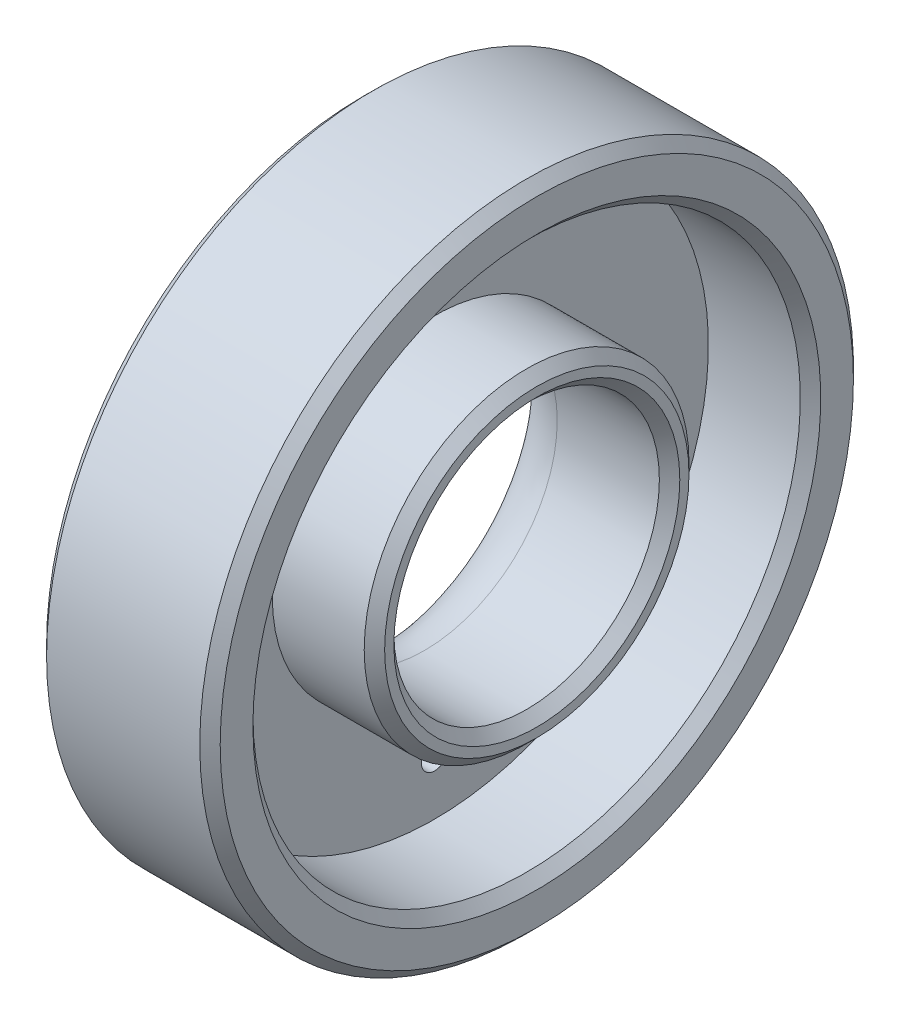
ISO-10303-21;
HEADER;
FILE_DESCRIPTION(('STEP AP214'),'2;1');
FILE_NAME('part.step','',(''),(''),'','','');
FILE_SCHEMA(('AUTOMOTIVE_DESIGN { 1 0 10303 214 1 1 1 1 }'));
ENDSEC;
DATA;
#1=APPLICATION_CONTEXT('core data for automotive mechanical design processes');
#2=APPLICATION_PROTOCOL_DEFINITION('international standard','automotive_design',2000,#1);
#3=PRODUCT_CONTEXT('',#1,'mechanical');
#4=PRODUCT('Part','Part','',(#3));
#5=PRODUCT_RELATED_PRODUCT_CATEGORY('part','',(#4));
#6=PRODUCT_DEFINITION_FORMATION('','',#4);
#7=PRODUCT_DEFINITION_CONTEXT('part definition',#1,'design');
#8=PRODUCT_DEFINITION('design','',#6,#7);
#9=PRODUCT_DEFINITION_SHAPE('','',#8);
#10=(LENGTH_UNIT() NAMED_UNIT(*) SI_UNIT(.MILLI.,.METRE.));
#11=(NAMED_UNIT(*) PLANE_ANGLE_UNIT() SI_UNIT($,.RADIAN.));
#12=(NAMED_UNIT(*) SI_UNIT($,.STERADIAN.) SOLID_ANGLE_UNIT());
#13=UNCERTAINTY_MEASURE_WITH_UNIT(LENGTH_MEASURE(1.E-05),#10,'distance_accuracy_value','');
#14=(GEOMETRIC_REPRESENTATION_CONTEXT(3) GLOBAL_UNCERTAINTY_ASSIGNED_CONTEXT((#13)) GLOBAL_UNIT_ASSIGNED_CONTEXT((#10,
#11,#12)) REPRESENTATION_CONTEXT('',''));
#15=CARTESIAN_POINT('',(0.,0.,0.));
#16=DIRECTION('',(0.,0.,1.));
#17=DIRECTION('',(1.,0.,0.));
#18=AXIS2_PLACEMENT_3D('',#15,#16,#17);
#19=CARTESIAN_POINT('',(0.,0.,0.));
#20=DIRECTION('',(-1.,0.,0.));
#21=DIRECTION('',(0.,0.,1.));
#22=AXIS2_PLACEMENT_3D('',#19,#20,#21);
#23=CYLINDRICAL_SURFACE('',#22,6.5);
#24=CARTESIAN_POINT('',(3.,0.,0.));
#25=DIRECTION('',(1.,0.,0.));
#26=DIRECTION('',(0.,0.,-1.));
#27=AXIS2_PLACEMENT_3D('',#24,#25,#26);
#28=CIRCLE('',#27,6.5);
#29=CARTESIAN_POINT('',(3.,0.,-6.5));
#30=VERTEX_POINT('',#29);
#31=EDGE_CURVE('E281',#30,#30,#28,.F.);
#32=ORIENTED_EDGE('',*,*,#31,.T.);
#33=EDGE_LOOP('',(#32));
#34=FACE_BOUND('',#33,.T.);
#35=CARTESIAN_POINT('',(7.99999999999999,0.,0.));
#36=DIRECTION('',(-1.,0.,0.));
#37=DIRECTION('',(0.,0.,1.));
#38=AXIS2_PLACEMENT_3D('',#35,#36,#37);
#39=CIRCLE('',#38,6.5);
#40=CARTESIAN_POINT('',(7.99999999999999,0.,6.5));
#41=VERTEX_POINT('',#40);
#42=EDGE_CURVE('E292',#41,#41,#39,.F.);
#43=ORIENTED_EDGE('',*,*,#42,.T.);
#44=EDGE_LOOP('',(#43));
#45=FACE_BOUND('',#44,.T.);
#46=ADVANCED_FACE('F75',(#34,#45),#23,.F.);
#47=CARTESIAN_POINT('',(0.,6.5,0.));
#48=DIRECTION('',(1.,0.,0.));
#49=DIRECTION('',(0.,0.,-1.));
#50=AXIS2_PLACEMENT_3D('',#47,#48,#49);
#51=PLANE('',#50);
#52=CARTESIAN_POINT('',(0.,0.,0.));
#53=DIRECTION('',(1.,0.,0.));
#54=DIRECTION('',(0.,0.,-1.));
#55=AXIS2_PLACEMENT_3D('',#52,#53,#54);
#56=CIRCLE('',#55,9.5);
#57=CARTESIAN_POINT('',(0.,0.,-9.5));
#58=VERTEX_POINT('',#57);
#59=EDGE_CURVE('E276',#58,#58,#56,.T.);
#60=ORIENTED_EDGE('',*,*,#59,.T.);
#61=EDGE_LOOP('',(#60));
#62=FACE_BOUND('',#61,.T.);
#63=CARTESIAN_POINT('',(0.,0.,0.));
#64=DIRECTION('',(-1.,0.,0.));
#65=DIRECTION('',(0.,0.,1.));
#66=AXIS2_PLACEMENT_3D('',#63,#64,#65);
#67=CIRCLE('',#66,10.);
#68=CARTESIAN_POINT('',(0.,0.,10.));
#69=VERTEX_POINT('',#68);
#70=EDGE_CURVE('E313',#69,#69,#67,.T.);
#71=ORIENTED_EDGE('',*,*,#70,.T.);
#72=EDGE_LOOP('',(#71));
#73=FACE_BOUND('',#72,.T.);
#74=ADVANCED_FACE('F210',(#62,#73),#51,.F.);
#75=CARTESIAN_POINT('',(0.,0.,0.));
#76=DIRECTION('',(-1.,0.,0.));
#77=DIRECTION('',(0.,0.,1.));
#78=AXIS2_PLACEMENT_3D('',#75,#76,#77);
#79=CYLINDRICAL_SURFACE('',#78,10.);
#80=CARTESIAN_POINT('',(1.,0.,0.));
#81=DIRECTION('',(1.,0.,0.));
#82=DIRECTION('',(0.,0.,-1.));
#83=AXIS2_PLACEMENT_3D('',#80,#81,#82);
#84=CIRCLE('',#83,10.);
#85=CARTESIAN_POINT('',(1.,9.99209730621221,-0.397481349482957));
#86=VERTEX_POINT('',#85);
#87=CARTESIAN_POINT('',(1.,-9.99209730621221,-0.397481349482957));
#88=VERTEX_POINT('',#87);
#89=EDGE_CURVE('E153',#86,#88,#84,.F.);
#90=ORIENTED_EDGE('',*,*,#89,.T.);
#91=CARTESIAN_POINT('',(1.01393889529611,-9.98748188079927,-0.500205638419064));
#92=CARTESIAN_POINT('',(1.26094614747874,-9.99108621051692,-0.428238881184554));
#93=CARTESIAN_POINT('',(1.2,-10.2392324063586,-0.458468346399119));
#94=CARTESIAN_POINT('',(1.00817827590106,-9.98845514776005,-0.480813657424555));
#95=CARTESIAN_POINT('',(1.24870135081678,-9.99092071823455,-0.428843020885227));
#96=CARTESIAN_POINT('',(1.2,-10.2308180850022,-0.450004270139507));
#97=CARTESIAN_POINT('',(1.00440826228374,-9.98938886193933,-0.461000762126404));
#98=CARTESIAN_POINT('',(1.23601976669922,-9.99102155969928,-0.425092530599041));
#99=CARTESIAN_POINT('',(1.2,-10.221857461722,-0.440540086592212));
#100=CARTESIAN_POINT('',(1.00016073447136,-9.99113208872384,-0.421486225170913));
#101=CARTESIAN_POINT('',(1.2127257776754,-9.99155617849597,-0.410882669632497));
#102=CARTESIAN_POINT('',(1.2,-10.2034733128877,-0.419704021681287));
#103=CARTESIAN_POINT('',(0.999607778645205,-9.99194400828471,-0.401792950222414));
#104=CARTESIAN_POINT('',(1.20199792857445,-9.99196522734535,-0.400926532510514));
#105=CARTESIAN_POINT('',(1.2,-10.1940656565981,-0.408382311025113));
#106=CARTESIAN_POINT('',(1.00122405165231,-9.99381676453322,-0.352835254848048));
#107=CARTESIAN_POINT('',(1.17918693129635,-9.99314951491188,-0.370720475428877));
#108=CARTESIAN_POINT('',(1.2,-10.1702810217527,-0.377417565216592));
#109=CARTESIAN_POINT('',(1.0048688408346,-9.99480312830396,-0.323636063819297));
#110=CARTESIAN_POINT('',(1.16822285164702,-9.99401151227683,-0.347790638035332));
#111=CARTESIAN_POINT('',(1.2,-10.1557395399794,-0.35642308983236));
#112=CARTESIAN_POINT('',(1.01542664626643,-9.9965209519464,-0.265398662147539));
#113=CARTESIAN_POINT('',(1.15261505228388,-9.99569114644533,-0.296115628221055));
#114=CARTESIAN_POINT('',(1.2,-10.1273304668872,-0.308759296438496));
#115=CARTESIAN_POINT('',(1.02239260456418,-9.99724793658135,-0.236371060231465));
#116=CARTESIAN_POINT('',(1.14763042473238,-9.99651923169225,-0.267345311364912));
#117=CARTESIAN_POINT('',(1.2,-10.1134779568295,-0.282002045668205));
#118=CARTESIAN_POINT('',(1.03477354028323,-9.99824974942065,-0.188086474825283));
#119=CARTESIAN_POINT('',(1.14301890866692,-9.99771820017016,-0.21637728575027));
#120=CARTESIAN_POINT('',(1.2,-10.0926462229877,-0.232559581718549));
#121=CARTESIAN_POINT('',(1.03994264235187,-9.99859462867629,-0.168763539561516));
#122=CARTESIAN_POINT('',(1.14210246227651,-9.99815109229987,-0.195299872111924));
#123=CARTESIAN_POINT('',(1.2,-10.0849066880229,-0.211440473911361));
#124=CARTESIAN_POINT('',(1.04976808189039,-9.9991741931411,-0.129970706323712));
#125=CARTESIAN_POINT('',(1.14142820767431,-9.99889078843015,-0.152026726884016));
#126=CARTESIAN_POINT('',(1.2,-10.0713027250444,-0.166693068270419));
#127=CARTESIAN_POINT('',(1.05442416997895,-9.99940882493719,-0.110500741748128));
#128=CARTESIAN_POINT('',(1.14164306976907,-9.99920284716109,-0.129707037034966));
#129=CARTESIAN_POINT('',(1.2,-10.0654392063678,-0.143063560972647));
#130=CARTESIAN_POINT('',(1.0619551093573,-9.99976204001561,-0.0716116659244834));
#131=CARTESIAN_POINT('',(1.14234432723638,-9.99967412321663,-0.0846330536394476));
#132=CARTESIAN_POINT('',(1.2,-10.0563885459129,-0.094162303504195));
#133=CARTESIAN_POINT('',(1.06486476238219,-9.99988291995912,-0.05219980919356));
#134=CARTESIAN_POINT('',(1.14282394826693,-9.99984016209408,-0.0617369199626993));
#135=CARTESIAN_POINT('',(1.2,-10.0531486301552,-0.0689345494743759));
#136=CARTESIAN_POINT('',(1.06794035392725,-10.0000101701079,-0.0131943749500304));
#137=CARTESIAN_POINT('',(1.14333237996413,-10.0000134817941,-0.0157032585818506));
#138=CARTESIAN_POINT('',(1.2,-10.0497330744253,-0.0175764833323067));
#139=CARTESIAN_POINT('',(1.06811420311756,-10.000016870472,0.00639851465208247));
#140=CARTESIAN_POINT('',(1.14336715971352,-10.0000228383233,0.00764419960404649));
#141=CARTESIAN_POINT('',(1.2,-10.0495485994606,0.00855100751509398));
#142=CARTESIAN_POINT('',(1.06565845352132,-9.99991595308489,0.0454383843468204));
#143=CARTESIAN_POINT('',(1.14295373680289,-9.99988514563594,0.0537619751883439));
#144=CARTESIAN_POINT('',(1.2,-10.0522644955052,0.0600841381349933));
#145=CARTESIAN_POINT('',(1.06302195184164,-9.99980805385197,0.0648848864706007));
#146=CARTESIAN_POINT('',(1.14250037198239,-9.99973640674016,0.0767461890759428));
#147=CARTESIAN_POINT('',(1.2,-10.0551724622489,0.0854878424155127));
#148=CARTESIAN_POINT('',(1.05595043010765,-9.99948314814208,0.103493924744983));
#149=CARTESIAN_POINT('',(1.14174600397899,-9.99930187066457,0.121629999125477));
#150=CARTESIAN_POINT('',(1.2,-10.0635599594641,0.134406273863107));
#151=CARTESIAN_POINT('',(1.05150876047644,-9.99926573754881,0.122655136500183));
#152=CARTESIAN_POINT('',(1.14144448492843,-9.99901192904543,0.143696858355935));
#153=CARTESIAN_POINT('',(1.2,-10.0690490095662,0.157913627659223));
#154=CARTESIAN_POINT('',(1.03709875080959,-9.99844366011241,0.180699049128594));
#155=CARTESIAN_POINT('',(1.1421027805827,-9.99794079758889,0.209560761254012));
#156=CARTESIAN_POINT('',(1.2,-10.0886102506093,0.225725455596811));
#157=CARTESIAN_POINT('',(1.0261904357448,-9.99767146211537,0.219347526705857));
#158=CARTESIAN_POINT('',(1.14485495805607,-9.99695257509146,0.251376553420333));
#159=CARTESIAN_POINT('',(1.2,-10.1056691608914,0.266205744405777));
#160=CARTESIAN_POINT('',(1.01137810414061,-9.9959530690961,0.285754746617808));
#161=CARTESIAN_POINT('',(1.15725659021772,-9.99512231349621,0.314752037992387));
#162=CARTESIAN_POINT('',(1.2,-10.1370996789942,0.326215574410983));
#163=CARTESIAN_POINT('',(1.00635284479425,-9.9951312001184,0.313250907940211));
#164=CARTESIAN_POINT('',(1.16499454792392,-9.99429789246465,0.339153842589436));
#165=CARTESIAN_POINT('',(1.2,-10.1507109043627,0.348372732067923));
#166=CARTESIAN_POINT('',(1.00023487060314,-9.99324945102985,0.36839353508515));
#167=CARTESIAN_POINT('',(1.18571421183111,-9.9927566063395,0.381282635460515));
#168=CARTESIAN_POINT('',(1.2,-10.1778514006552,0.387848284177243));
#169=CARTESIAN_POINT('',(0.999092429642718,-9.99219276661792,0.39603352414383));
#170=CARTESIAN_POINT('',(1.19905163535429,-9.99203924247926,0.398828397444087));
#171=CARTESIAN_POINT('',(1.2,-10.191379475575,0.405225223574262));
#172=CARTESIAN_POINT('',(1.00178270561838,-9.99034243233622,0.439680044195267));
#173=CARTESIAN_POINT('',(1.22308934315962,-9.99128164114497,0.418038366056785));
#174=CARTESIAN_POINT('',(1.2,-10.2119927976637,0.429521023718165));
#175=CARTESIAN_POINT('',(1.00375840304897,-9.9896199554813,0.455784584081325));
#176=CARTESIAN_POINT('',(1.23291171167736,-9.99108699258626,0.423223100934515));
#177=CARTESIAN_POINT('',(1.2,-10.2194348064614,0.437797853699398));
#178=CARTESIAN_POINT('',(1.01009337160961,-9.98811031215537,0.487769118271115));
#179=CARTESIAN_POINT('',(1.25308526753055,-9.99096369874569,0.42892539023925));
#180=CARTESIAN_POINT('',(1.2,-10.2338448987939,0.453112175280778));
#181=CARTESIAN_POINT('',(1.01448728687674,-9.98732235025935,0.503642321956641));
#182=CARTESIAN_POINT('',(1.26344403874434,-9.99105229434255,0.429135817320086));
#183=CARTESIAN_POINT('',(1.2,-10.2408043977913,0.460129639322933));
#184=CARTESIAN_POINT('',(1.02028174967016,-9.98651796358676,0.519094368067051));
#185=CARTESIAN_POINT('',(1.27297856074629,-9.99134025995341,0.426321353652391));
#186=CARTESIAN_POINT('',(1.2,-10.2473598531418,0.466494263043169));
#187=(BOUNDED_SURFACE() B_SPLINE_SURFACE(3,2,((#91,#92,#93),(#94,#95,#96),(#97,#98,#99),(#100,
#101,#102),(#103,#104,#105),(#106,#107,#108),(#109,#110,#111),(#112,#113,#114),(#115,#116,#117),
(#118,#119,#120),(#121,#122,#123),(#124,#125,#126),(#127,#128,#129),(#130,#131,#132),(#133,#134,
#135),(#136,#137,#138),(#139,#140,#141),(#142,#143,#144),(#145,#146,#147),(#148,#149,#150),
(#151,#152,#153),(#154,#155,#156),(#157,#158,#159),(#160,#161,#162),(#163,#164,#165),(#166,#167,
#168),(#169,#170,#171),(#172,#173,#174),(#175,#176,#177),(#178,#179,#180),(#181,#182,#183),
(#184,#185,#186)),.UNSPECIFIED.,.F.,.F.,.F.) B_SPLINE_SURFACE_WITH_KNOTS((4,2,2,2,2,2,2,2,2,2,2,
2,2,2,2,4),(3,3),(0.,0.0615664878229,0.121683200903473,0.211421408028194,0.302640540600691,
0.363784139852125,0.424957331704516,0.484867117893628,0.544603640957476,0.604487230024891,
0.664593437034093,0.787269169648407,0.872638613185488,0.956910549804566,1.00643785821764,
1.05669391092893),(0.,1.),
.UNSPECIFIED.) GEOMETRIC_REPRESENTATION_ITEM() RATIONAL_B_SPLINE_SURFACE(((1.,0.613702577861386,
1.),(1.,0.631508071168869,1.),(1.,0.649688661722157,1.),(1.,0.685610909620171,1.),(1.,
0.703352821627621,1.),(1.,0.746682462807926,1.),(1.,0.771828599637985,1.),(1.,0.818985641414551,
1.),(1.,0.840937958172457,1.),(1.,0.872999458889096,1.),(1.,0.88462704412909,1.),(1.,
0.904773860862368,1.),(1.,0.91329158523458,1.),(1.,0.926336576357864,1.),(1.,0.930942624571576,
1.),(1.,0.935796362520703,1.),(1.,0.936056618396321,1.),(1.,0.932199963928644,1.),(1.,
0.928072275814249,1.),(1.,0.916011926871411,1.),(1.,0.90806517805667,1.),(1.,0.879211786093441,
1.),(1.,0.853425571858961,1.),(1.,0.80299326569878,1.),(1.,0.780385160399681,1.),(1.,
0.733147015034967,1.),(1.,0.708546705475811,1.),(1.,0.66911145805643,1.),(1.,0.654432009509413,
1.),(1.,0.625145502109323,1.),(1.,0.610542686519908,1.),(1.,0.596322522335899,1.))) REPRESENTATION_ITEM('') SURFACE());
#188=CARTESIAN_POINT('',(1.01393889529611,-9.98748188079927,-0.500205638419064));
#189=CARTESIAN_POINT('',(1.00817827590106,-9.98845514776005,-0.480813657424555));
#190=CARTESIAN_POINT('',(1.00440826228374,-9.98938886193933,-0.461000762126404));
#191=CARTESIAN_POINT('',(1.00016073447136,-9.99113208872384,-0.421486225170913));
#192=CARTESIAN_POINT('',(0.999607778645205,-9.99194400828471,-0.401792950222414));
#193=CARTESIAN_POINT('',(1.00122405165231,-9.99381676453322,-0.352835254848048));
#194=CARTESIAN_POINT('',(1.0048688408346,-9.99480312830396,-0.323636063819297));
#195=CARTESIAN_POINT('',(1.01542664626643,-9.9965209519464,-0.265398662147539));
#196=CARTESIAN_POINT('',(1.02239260456418,-9.99724793658135,-0.236371060231465));
#197=CARTESIAN_POINT('',(1.03477354028323,-9.99824974942065,-0.188086474825283));
#198=CARTESIAN_POINT('',(1.03994264235187,-9.99859462867629,-0.168763539561516));
#199=CARTESIAN_POINT('',(1.04976808189039,-9.9991741931411,-0.129970706323712));
#200=CARTESIAN_POINT('',(1.05442416997895,-9.99940882493719,-0.110500741748128));
#201=CARTESIAN_POINT('',(1.0619551093573,-9.99976204001561,-0.0716116659244834));
#202=CARTESIAN_POINT('',(1.06486476238219,-9.99988291995912,-0.05219980919356));
#203=CARTESIAN_POINT('',(1.06794035392725,-10.0000101701079,-0.0131943749500304));
#204=CARTESIAN_POINT('',(1.06811420311756,-10.000016870472,0.00639851465208247));
#205=CARTESIAN_POINT('',(1.06565845352132,-9.99991595308489,0.0454383843468204));
#206=CARTESIAN_POINT('',(1.06302195184164,-9.99980805385197,0.0648848864706006));
#207=CARTESIAN_POINT('',(1.05595043010765,-9.99948314814208,0.103493924744983));
#208=CARTESIAN_POINT('',(1.05150876047644,-9.99926573754881,0.122655136500183));
#209=CARTESIAN_POINT('',(1.03709875080959,-9.99844366011241,0.180699049128594));
#210=CARTESIAN_POINT('',(1.0261904357448,-9.99767146211537,0.219347526705857));
#211=CARTESIAN_POINT('',(1.01137810414061,-9.9959530690961,0.285754746617808));
#212=CARTESIAN_POINT('',(1.00635284479425,-9.9951312001184,0.313250907940211));
#213=CARTESIAN_POINT('',(1.00023487060314,-9.99324945102985,0.36839353508515));
#214=CARTESIAN_POINT('',(0.999092429642718,-9.99219276661792,0.39603352414383));
#215=CARTESIAN_POINT('',(1.00178270561838,-9.99034243233622,0.439680044195267));
#216=CARTESIAN_POINT('',(1.00375840304897,-9.9896199554813,0.455784584081325));
#217=CARTESIAN_POINT('',(1.01009337160961,-9.98811031215537,0.487769118271115));
#218=CARTESIAN_POINT('',(1.01448728687674,-9.98732235025935,0.503642321956641));
#219=CARTESIAN_POINT('',(1.02028174967016,-9.98651796358676,0.519094368067051));
#220=B_SPLINE_CURVE_WITH_KNOTS('',3,(#188,#189,#190,#191,#192,#193,#194,#195,#196,#197,#198,
#199,#200,#201,#202,#203,#204,#205,#206,#207,#208,#209,#210,#211,#212,#213,#214,#215,#216,#217,
#218,#219),.UNSPECIFIED.,.F.,.F.,(4,2,2,2,2,2,2,2,2,2,2,2,2,2,2,4),(0.,0.0615664878229,
0.121683200903473,0.211421408028194,0.302640540600691,0.363784139852125,0.424957331704516,
0.484867117893628,0.544603640957476,0.604487230024891,0.664593437034093,0.787269169648407,
0.872638613185488,0.956910549804566,1.00643785821764,1.05669391092893),.UNSPECIFIED.);
#221=CARTESIAN_POINT('',(1.,-9.99209730621221,0.397481349482957));
#222=VERTEX_POINT('',#221);
#223=EDGE_CURVE('E14',#88,#222,#220,.T.);
#224=ORIENTED_EDGE('',*,*,#223,.T.);
#225=CARTESIAN_POINT('',(1.,0.,0.));
#226=DIRECTION('',(1.,0.,0.));
#227=DIRECTION('',(0.,0.,-1.));
#228=AXIS2_PLACEMENT_3D('',#225,#226,#227);
#229=CIRCLE('',#228,10.);
#230=CARTESIAN_POINT('',(1.,9.99209730621221,0.397481349482957));
#231=VERTEX_POINT('',#230);
#232=EDGE_CURVE('E88',#222,#231,#229,.F.);
#233=ORIENTED_EDGE('',*,*,#232,.T.);
#234=CARTESIAN_POINT('',(1.01393889529611,9.98748188079927,0.500205638419064));
#235=CARTESIAN_POINT('',(1.26094615147867,9.991086210428,0.428238882960009));
#236=CARTESIAN_POINT('',(1.2,10.2392324086842,0.458468348736382));
#237=CARTESIAN_POINT('',(1.00817827590106,9.98845514776005,0.480813657424555));
#238=CARTESIAN_POINT('',(1.24870135218427,9.99092071820291,0.428843021509816));
#239=CARTESIAN_POINT('',(1.2,10.2308180858411,0.450004270983258));
#240=CARTESIAN_POINT('',(1.00440826228374,9.98938886193933,0.461000762126404));
#241=CARTESIAN_POINT('',(1.23601976704675,9.9910215596911,0.425092530759399));
#242=CARTESIAN_POINT('',(1.2,10.2218574619473,0.440540086818922));
#243=CARTESIAN_POINT('',(1.00016073447136,9.99113208872384,0.421486225170913));
#244=CARTESIAN_POINT('',(1.2127257773698,9.99155617850317,0.410882669493868));
#245=CARTESIAN_POINT('',(1.2,10.2034733126678,0.419704021459923));
#246=CARTESIAN_POINT('',(0.999607778645205,9.99194400828471,0.401792950222414));
#247=CARTESIAN_POINT('',(1.20199792848244,9.99196522734749,0.400926532469487));
#248=CARTESIAN_POINT('',(1.2,10.1940656565285,0.408382310954549));
#249=CARTESIAN_POINT('',(1.00122405165231,9.99381676453322,0.352835254848048));
#250=CARTESIAN_POINT('',(1.1791869314186,9.99314951490924,0.370720475477153));
#251=CARTESIAN_POINT('',(1.2,10.1702810218562,0.377417565321441));
#252=CARTESIAN_POINT('',(1.0048688408346,9.99480312830396,0.323636063819297));
#253=CARTESIAN_POINT('',(1.16822285167726,9.99401151227625,0.347790638047591));
#254=CARTESIAN_POINT('',(1.2,10.1557395400063,0.356423089863035));
#255=CARTESIAN_POINT('',(1.01542664626643,9.9965209519464,0.265398662147539));
#256=CARTESIAN_POINT('',(1.15261505225535,9.99569114644581,0.296115628211507));
#257=CARTESIAN_POINT('',(1.2,10.1273304668587,0.308759296405399));
#258=CARTESIAN_POINT('',(1.02239260456418,9.99724793658135,0.236371060231465));
#259=CARTESIAN_POINT('',(1.14763042472666,9.99651923169231,0.267345311354787));
#260=CARTESIAN_POINT('',(1.2,10.1134779568242,0.282002045646924));
#261=CARTESIAN_POINT('',(1.03477354028323,9.99824974942065,0.188086474825285));
#262=CARTESIAN_POINT('',(1.14301890867068,9.99771820017013,0.216377285756776));
#263=CARTESIAN_POINT('',(1.2,10.0926462229915,0.232559581733448));
#264=CARTESIAN_POINT('',(1.03994264235186,9.99859462867629,0.168763539561519));
#265=CARTESIAN_POINT('',(1.14210246227715,9.99815109229991,0.195299872131133));
#266=CARTESIAN_POINT('',(1.2,10.0849066880225,0.211440473945203));
#267=CARTESIAN_POINT('',(1.04976808189039,9.9991741931411,0.12997070632372));
#268=CARTESIAN_POINT('',(1.14142820767369,9.99889078843011,0.152026726865272));
#269=CARTESIAN_POINT('',(1.2,10.0713027250449,0.166693068236613));
#270=CARTESIAN_POINT('',(1.05442416997895,9.99940882493719,0.110500741748137));
#271=CARTESIAN_POINT('',(1.14164306977018,9.99920284716091,0.129707036966045));
#272=CARTESIAN_POINT('',(1.2,10.0654392063734,0.143063560852199));
#273=CARTESIAN_POINT('',(1.0619551093573,9.99976204001561,0.0716116659244909));
#274=CARTESIAN_POINT('',(1.14234432723506,9.99967412321682,0.0846330537034324));
#275=CARTESIAN_POINT('',(1.2,10.0563885459064,0.0941623036171701));
#276=CARTESIAN_POINT('',(1.06486476238218,9.99988291995912,0.0521998091935637));
#277=CARTESIAN_POINT('',(1.14282394826162,9.99984016209474,0.0617369202038457));
#278=CARTESIAN_POINT('',(1.2,10.053148630132,0.0689345498990528));
#279=CARTESIAN_POINT('',(1.06794035392725,10.0000101701079,0.0131943749500302));
#280=CARTESIAN_POINT('',(1.1433323799693,10.0000134817934,0.0157032583367242));
#281=CARTESIAN_POINT('',(1.2,10.0497330744479,0.017576482901271));
#282=CARTESIAN_POINT('',(1.06811420311756,10.000016870472,-0.00639851465208276));
#283=CARTESIAN_POINT('',(1.14336715973309,10.0000228383209,-0.00764420051358223));
#284=CARTESIAN_POINT('',(1.2,10.0495485995454,-0.00855100910926889));
#285=CARTESIAN_POINT('',(1.06565845352116,9.99991595308488,-0.0454383843492615));
#286=CARTESIAN_POINT('',(1.14295373682196,9.99988514563356,-0.0537619761135903));
#287=CARTESIAN_POINT('',(1.2,10.0522644955893,-0.0600841397372932));
#288=CARTESIAN_POINT('',(1.06302195184097,9.99980805385194,-0.0648848864754583));
#289=CARTESIAN_POINT('',(1.14250037198637,9.99973640673954,-0.0767461893349835));
#290=CARTESIAN_POINT('',(1.2,10.0551724622702,-0.0854878428569777));
#291=CARTESIAN_POINT('',(1.05595043010566,9.99948314814199,-0.103493924754608));
#292=CARTESIAN_POINT('',(1.14174600397483,9.99930187066504,-0.121629998879842));
#293=CARTESIAN_POINT('',(1.2,10.0635599594465,-0.134406273441941));
#294=CARTESIAN_POINT('',(1.05150876047364,9.99926573754867,-0.122655136512158));
#295=CARTESIAN_POINT('',(1.14144448493142,9.99901192904516,-0.143696858290134));
#296=CARTESIAN_POINT('',(1.2,10.0690490095726,-0.157913627541698));
#297=CARTESIAN_POINT('',(1.03709875080686,9.99844366011222,-0.180699049138066));
#298=CARTESIAN_POINT('',(1.14210278057661,9.99794079758886,-0.209560761429928));
#299=CARTESIAN_POINT('',(1.2,10.0886102506071,-0.225725455875114));
#300=CARTESIAN_POINT('',(1.02619043574372,9.99767146211524,-0.219347526710658));
#301=CARTESIAN_POINT('',(1.14485495799688,9.99695257509563,-0.251376553297417));
#302=CARTESIAN_POINT('',(1.2,10.1056691607727,-0.266205744241377));
#303=CARTESIAN_POINT('',(1.01137810414062,9.9959530690961,-0.28575474661781));
#304=CARTESIAN_POINT('',(1.15725659016534,9.99512231350023,-0.314752037807695));
#305=CARTESIAN_POINT('',(1.2,10.1370996788967,-0.326215574181411));
#306=CARTESIAN_POINT('',(1.00635284479425,9.9951312001184,-0.313250907940211));
#307=CARTESIAN_POINT('',(1.16499454790942,9.99429789246578,-0.339153842538307));
#308=CARTESIAN_POINT('',(1.2,10.1507109043371,-0.348372732007698));
#309=CARTESIAN_POINT('',(1.00023487060314,9.99324945102985,-0.36839353508515));
#310=CARTESIAN_POINT('',(1.18571421184762,9.99275660633822,-0.381282635516783));
#311=CARTESIAN_POINT('',(1.2,10.1778514006806,-0.387848284236947));
#312=CARTESIAN_POINT('',(0.999092429642717,9.99219276661792,-0.396033524143829));
#313=CARTESIAN_POINT('',(1.19905163535814,9.99203924247896,-0.398828397457064));
#314=CARTESIAN_POINT('',(1.2,10.1913794755806,-0.40522522358733));
#315=CARTESIAN_POINT('',(1.00178270561838,9.99034243233622,-0.439680044195267));
#316=CARTESIAN_POINT('',(1.22308934315693,9.99128164114516,-0.418038366048465));
#317=CARTESIAN_POINT('',(1.2,10.2119927976604,-0.429521023710389));
#318=CARTESIAN_POINT('',(1.00375840304897,9.9896199554813,-0.455784584081325));
#319=CARTESIAN_POINT('',(1.23291171167595,9.99108699258636,-0.423223100930193));
#320=CARTESIAN_POINT('',(1.2,10.2194348064597,-0.437797853695479));
#321=CARTESIAN_POINT('',(1.01009337160961,9.98811031215537,-0.487769118271115));
#322=CARTESIAN_POINT('',(1.25308526753188,9.99096369874559,-0.428925390243705));
#323=CARTESIAN_POINT('',(1.2,10.2338448987954,-0.45311217528458));
#324=CARTESIAN_POINT('',(1.01448728687674,9.98732235025935,-0.503642321956641));
#325=CARTESIAN_POINT('',(1.26344403874714,9.99105229434234,-0.429135817329312));
#326=CARTESIAN_POINT('',(1.2,10.2408043977944,-0.460129639330597));
#327=CARTESIAN_POINT('',(1.02028174967016,9.98651796358676,-0.519094368067051));
#328=CARTESIAN_POINT('',(1.2729785607451,9.99134025995343,-0.426321353652006));
#329=CARTESIAN_POINT('',(1.2,10.2473598531412,-0.46649426304255));
#330=(BOUNDED_SURFACE() B_SPLINE_SURFACE(3,2,((#234,#235,#236),(#237,#238,#239),(#240,#241,
#242),(#243,#244,#245),(#246,#247,#248),(#249,#250,#251),(#252,#253,#254),(#255,#256,#257),
(#258,#259,#260),(#261,#262,#263),(#264,#265,#266),(#267,#268,#269),(#270,#271,#272),(#273,#274,
#275),(#276,#277,#278),(#279,#280,#281),(#282,#283,#284),(#285,#286,#287),(#288,#289,#290),
(#291,#292,#293),(#294,#295,#296),(#297,#298,#299),(#300,#301,#302),(#303,#304,#305),(#306,#307,
#308),(#309,#310,#311),(#312,#313,#314),(#315,#316,#317),(#318,#319,#320),(#321,#322,#323),
(#324,#325,#326),(#327,#328,#329)),.UNSPECIFIED.,.F.,.F.,.F.) B_SPLINE_SURFACE_WITH_KNOTS((4,2,
2,2,2,2,2,2,2,2,2,2,2,2,2,4),(3,3),(0.,0.0615664878229,0.121683200903473,0.211421408028194,
0.302640540600691,0.363784139852119,0.424957331704505,0.484867117893628,0.544603640957476,
0.604487230032372,0.664593437049133,0.787269169648396,0.872638613185476,0.956910549804555,
1.00643785821763,1.05669391092892),(0.,1.),
.UNSPECIFIED.) GEOMETRIC_REPRESENTATION_ITEM() RATIONAL_B_SPLINE_SURFACE(((1.,0.613702572892367,
1.),(1.,0.631508069376387,1.),(1.,0.649688661240843,1.),(1.,0.685610910090138,1.),(1.,
0.703352821776326,1.),(1.,0.746682462586626,1.),(1.,0.771828599580221,1.),(1.,0.818985641475155,
1.),(1.,0.840937958184404,1.),(1.,0.872999458880681,1.),(1.,0.884627044128886,1.),(1.,
0.904773860862548,1.),(1.,0.913291585226925,1.),(1.,0.926336576366681,1.),(1.,0.930942624604036,
1.),(1.,0.935796362489046,1.),(1.,0.936056618277224,1.),(1.,0.932199963810732,1.),(1.,
0.928072275784847,1.),(1.,0.916011926895519,1.),(1.,0.908065178045315,1.),(1.,0.879211786100245,
1.),(1.,0.853425572048734,1.),(1.,0.80299326585352,1.),(1.,0.780385160440193,1.),(1.,
0.733147014994676,1.),(1.,0.708546705467065,1.),(1.,0.669111458061729,1.),(1.,0.65443200951207,
1.),(1.,0.625145502106963,1.),(1.,0.610542686515178,1.),(1.,0.596322522337303,1.))) REPRESENTATION_ITEM('') SURFACE());
#331=CARTESIAN_POINT('',(1.01393889529611,9.98748188079927,0.500205638419064));
#332=CARTESIAN_POINT('',(1.00817827590106,9.98845514776005,0.480813657424555));
#333=CARTESIAN_POINT('',(1.00440826228374,9.98938886193933,0.461000762126404));
#334=CARTESIAN_POINT('',(1.00016073447136,9.99113208872384,0.421486225170913));
#335=CARTESIAN_POINT('',(0.999607778645205,9.99194400828471,0.401792950222414));
#336=CARTESIAN_POINT('',(1.00122405165231,9.99381676453322,0.352835254848048));
#337=CARTESIAN_POINT('',(1.0048688408346,9.99480312830396,0.323636063819297));
#338=CARTESIAN_POINT('',(1.01542664626643,9.9965209519464,0.265398662147539));
#339=CARTESIAN_POINT('',(1.02239260456418,9.99724793658135,0.236371060231465));
#340=CARTESIAN_POINT('',(1.03477354028323,9.99824974942065,0.188086474825285));
#341=CARTESIAN_POINT('',(1.03994264235186,9.99859462867629,0.168763539561519));
#342=CARTESIAN_POINT('',(1.04976808189039,9.9991741931411,0.12997070632372));
#343=CARTESIAN_POINT('',(1.05442416997895,9.99940882493719,0.110500741748137));
#344=CARTESIAN_POINT('',(1.0619551093573,9.99976204001561,0.0716116659244909));
#345=CARTESIAN_POINT('',(1.06486476238218,9.99988291995912,0.0521998091935637));
#346=CARTESIAN_POINT('',(1.06794035392725,10.0000101701079,0.0131943749500302));
#347=CARTESIAN_POINT('',(1.06811420311756,10.000016870472,-0.00639851465208276));
#348=CARTESIAN_POINT('',(1.06565845352116,9.99991595308488,-0.0454383843492615));
#349=CARTESIAN_POINT('',(1.06302195184097,9.99980805385194,-0.0648848864754582));
#350=CARTESIAN_POINT('',(1.05595043010566,9.99948314814199,-0.103493924754608));
#351=CARTESIAN_POINT('',(1.05150876047364,9.99926573754867,-0.122655136512158));
#352=CARTESIAN_POINT('',(1.03709875080686,9.99844366011222,-0.180699049138066));
#353=CARTESIAN_POINT('',(1.02619043574372,9.99767146211524,-0.219347526710658));
#354=CARTESIAN_POINT('',(1.01137810414062,9.9959530690961,-0.28575474661781));
#355=CARTESIAN_POINT('',(1.00635284479425,9.9951312001184,-0.313250907940211));
#356=CARTESIAN_POINT('',(1.00023487060314,9.99324945102985,-0.36839353508515));
#357=CARTESIAN_POINT('',(0.999092429642717,9.99219276661792,-0.396033524143829));
#358=CARTESIAN_POINT('',(1.00178270561838,9.99034243233622,-0.439680044195267));
#359=CARTESIAN_POINT('',(1.00375840304897,9.9896199554813,-0.455784584081325));
#360=CARTESIAN_POINT('',(1.01009337160961,9.98811031215537,-0.487769118271115));
#361=CARTESIAN_POINT('',(1.01448728687674,9.98732235025935,-0.503642321956641));
#362=CARTESIAN_POINT('',(1.02028174967016,9.98651796358676,-0.519094368067051));
#363=B_SPLINE_CURVE_WITH_KNOTS('',3,(#331,#332,#333,#334,#335,#336,#337,#338,#339,#340,#341,
#342,#343,#344,#345,#346,#347,#348,#349,#350,#351,#352,#353,#354,#355,#356,#357,#358,#359,#360,
#361,#362),.UNSPECIFIED.,.F.,.F.,(4,2,2,2,2,2,2,2,2,2,2,2,2,2,2,4),(0.,0.0615664878229,
0.121683200903473,0.211421408028194,0.302640540600691,0.363784139852119,0.424957331704505,
0.484867117893628,0.544603640957476,0.604487230032372,0.664593437049133,0.787269169648396,
0.872638613185476,0.956910549804555,1.00643785821763,1.05669391092892),.UNSPECIFIED.);
#364=EDGE_CURVE('E249',#231,#86,#363,.T.);
#365=ORIENTED_EDGE('',*,*,#364,.T.);
#366=EDGE_LOOP('',(#90,#224,#233,#365));
#367=FACE_BOUND('',#366,.T.);
#368=ORIENTED_EDGE('',*,*,#70,.F.);
#369=EDGE_LOOP('',(#368));
#370=FACE_BOUND('',#369,.T.);
#371=ADVANCED_FACE('F216',(#367,#370),#79,.T.);
#372=CARTESIAN_POINT('',(1.2,10.,0.));
#373=DIRECTION('',(1.,0.,0.));
#374=DIRECTION('',(0.,0.,-1.));
#375=AXIS2_PLACEMENT_3D('',#372,#373,#374);
#376=PLANE('',#375);
#377=CARTESIAN_POINT('',(1.2,0.,0.));
#378=DIRECTION('',(1.,0.,0.));
#379=DIRECTION('',(0.,0.,-1.));
#380=AXIS2_PLACEMENT_3D('',#377,#378,#379);
#381=CIRCLE('',#380,12.6);
#382=CARTESIAN_POINT('',(1.2,0.,-12.6));
#383=VERTEX_POINT('',#382);
#384=EDGE_CURVE('E133',#383,#383,#381,.F.);
#385=ORIENTED_EDGE('',*,*,#384,.T.);
#386=EDGE_LOOP('',(#385));
#387=FACE_BOUND('',#386,.T.);
#388=CARTESIAN_POINT('',(1.2,-10.7,0.));
#389=DIRECTION('',(-1.,0.,0.));
#390=DIRECTION('',(0.,0.,1.));
#391=AXIS2_PLACEMENT_3D('',#388,#389,#390);
#392=CIRCLE('',#391,0.649999999999987);
#393=CARTESIAN_POINT('',(1.2,-10.1919392523365,-0.405430976472617));
#394=VERTEX_POINT('',#393);
#395=CARTESIAN_POINT('',(1.2,-10.1919392523365,0.405430976472617));
#396=VERTEX_POINT('',#395);
#397=EDGE_CURVE('E128',#394,#396,#392,.T.);
#398=ORIENTED_EDGE('',*,*,#397,.F.);
#399=CARTESIAN_POINT('',(1.2,0.,0.));
#400=DIRECTION('',(1.,0.,0.));
#401=DIRECTION('',(0.,0.,-1.));
#402=AXIS2_PLACEMENT_3D('',#399,#400,#401);
#403=CIRCLE('',#402,10.2);
#404=CARTESIAN_POINT('',(1.2,10.1919392523365,-0.405430976472617));
#405=VERTEX_POINT('',#404);
#406=EDGE_CURVE('E122',#394,#405,#403,.T.);
#407=ORIENTED_EDGE('',*,*,#406,.T.);
#408=CARTESIAN_POINT('',(1.2,10.7,0.));
#409=DIRECTION('',(-1.,0.,0.));
#410=DIRECTION('',(0.,0.,1.));
#411=AXIS2_PLACEMENT_3D('',#408,#409,#410);
#412=CIRCLE('',#411,0.649999999999987);
#413=CARTESIAN_POINT('',(1.2,10.1919392523365,0.405430976472616));
#414=VERTEX_POINT('',#413);
#415=EDGE_CURVE('E125',#414,#405,#412,.T.);
#416=ORIENTED_EDGE('',*,*,#415,.F.);
#417=CARTESIAN_POINT('',(1.2,0.,0.));
#418=DIRECTION('',(1.,0.,0.));
#419=DIRECTION('',(0.,0.,-1.));
#420=AXIS2_PLACEMENT_3D('',#417,#418,#419);
#421=CIRCLE('',#420,10.2);
#422=EDGE_CURVE('E134',#414,#396,#421,.T.);
#423=ORIENTED_EDGE('',*,*,#422,.T.);
#424=EDGE_LOOP('',(#398,#407,#416,#423));
#425=FACE_BOUND('',#424,.T.);
#426=ADVANCED_FACE('F124',(#387,#425),#376,.F.);
#427=CARTESIAN_POINT('',(0.,0.,0.));
#428=DIRECTION('',(-1.,0.,0.));
#429=DIRECTION('',(0.,0.,1.));
#430=AXIS2_PLACEMENT_3D('',#427,#428,#429);
#431=CYLINDRICAL_SURFACE('',#430,12.8);
#432=CARTESIAN_POINT('',(1.,0.,0.));
#433=DIRECTION('',(1.,0.,0.));
#434=DIRECTION('',(0.,0.,-1.));
#435=AXIS2_PLACEMENT_3D('',#432,#433,#434);
#436=CIRCLE('',#435,12.8);
#437=CARTESIAN_POINT('',(1.,0.,-12.8));
#438=VERTEX_POINT('',#437);
#439=EDGE_CURVE('E268',#438,#438,#436,.T.);
#440=ORIENTED_EDGE('',*,*,#439,.T.);
#441=EDGE_LOOP('',(#440));
#442=FACE_BOUND('',#441,.T.);
#443=CARTESIAN_POINT('',(0.,0.,0.));
#444=DIRECTION('',(-1.,0.,0.));
#445=DIRECTION('',(0.,0.,1.));
#446=AXIS2_PLACEMENT_3D('',#443,#444,#445);
#447=CIRCLE('',#446,12.8);
#448=CARTESIAN_POINT('',(0.,0.,12.8));
#449=VERTEX_POINT('',#448);
#450=EDGE_CURVE('E316',#449,#449,#447,.T.);
#451=ORIENTED_EDGE('',*,*,#450,.T.);
#452=EDGE_LOOP('',(#451));
#453=FACE_BOUND('',#452,.T.);
#454=ADVANCED_FACE('F362',(#442,#453),#431,.F.);
#455=CARTESIAN_POINT('',(0.,12.8,0.));
#456=DIRECTION('',(1.,0.,0.));
#457=DIRECTION('',(0.,0.,-1.));
#458=AXIS2_PLACEMENT_3D('',#455,#456,#457);
#459=PLANE('',#458);
#460=CARTESIAN_POINT('',(0.,0.,0.));
#461=DIRECTION('',(1.,0.,0.));
#462=DIRECTION('',(0.,0.,-1.));
#463=AXIS2_PLACEMENT_3D('',#460,#461,#462);
#464=CIRCLE('',#463,15.5);
#465=CARTESIAN_POINT('',(0.,0.,-15.5));
#466=VERTEX_POINT('',#465);
#467=EDGE_CURVE('E289',#466,#466,#464,.F.);
#468=ORIENTED_EDGE('',*,*,#467,.T.);
#469=EDGE_LOOP('',(#468));
#470=FACE_BOUND('',#469,.T.);
#471=ORIENTED_EDGE('',*,*,#450,.F.);
#472=EDGE_LOOP('',(#471));
#473=FACE_BOUND('',#472,.T.);
#474=ADVANCED_FACE('F359',(#470,#473),#459,.F.);
#475=CARTESIAN_POINT('',(0.,0.,0.));
#476=DIRECTION('',(-1.,0.,0.));
#477=DIRECTION('',(0.,0.,1.));
#478=AXIS2_PLACEMENT_3D('',#475,#476,#477);
#479=CYLINDRICAL_SURFACE('',#478,16.);
#480=CARTESIAN_POINT('',(0.500000000000014,0.,0.));
#481=DIRECTION('',(1.,0.,0.));
#482=DIRECTION('',(0.,0.,-1.));
#483=AXIS2_PLACEMENT_3D('',#480,#481,#482);
#484=CIRCLE('',#483,16.);
#485=CARTESIAN_POINT('',(0.500000000000014,0.,-16.));
#486=VERTEX_POINT('',#485);
#487=EDGE_CURVE('E283',#486,#486,#484,.T.);
#488=ORIENTED_EDGE('',*,*,#487,.T.);
#489=EDGE_LOOP('',(#488));
#490=FACE_BOUND('',#489,.T.);
#491=CARTESIAN_POINT('',(8.,0.,0.));
#492=DIRECTION('',(-1.,0.,0.));
#493=DIRECTION('',(0.,0.,1.));
#494=AXIS2_PLACEMENT_3D('',#491,#492,#493);
#495=CIRCLE('',#494,16.);
#496=CARTESIAN_POINT('',(8.,0.,16.));
#497=VERTEX_POINT('',#496);
#498=EDGE_CURVE('E286',#497,#497,#495,.T.);
#499=ORIENTED_EDGE('',*,*,#498,.T.);
#500=EDGE_LOOP('',(#499));
#501=FACE_BOUND('',#500,.T.);
#502=ADVANCED_FACE('F355',(#490,#501),#479,.T.);
#503=CARTESIAN_POINT('',(8.5,16.,0.));
#504=DIRECTION('',(-1.,0.,0.));
#505=DIRECTION('',(0.,0.,1.));
#506=AXIS2_PLACEMENT_3D('',#503,#504,#505);
#507=PLANE('',#506);
#508=CARTESIAN_POINT('',(8.5,0.,0.));
#509=DIRECTION('',(-1.,0.,0.));
#510=DIRECTION('',(0.,0.,1.));
#511=AXIS2_PLACEMENT_3D('',#508,#509,#510);
#512=CIRCLE('',#511,13.9);
#513=CARTESIAN_POINT('',(8.5,0.,13.9));
#514=VERTEX_POINT('',#513);
#515=EDGE_CURVE('E307',#514,#514,#512,.T.);
#516=ORIENTED_EDGE('',*,*,#515,.T.);
#517=EDGE_LOOP('',(#516));
#518=FACE_BOUND('',#517,.T.);
#519=CARTESIAN_POINT('',(8.5,0.,0.));
#520=DIRECTION('',(-1.,0.,0.));
#521=DIRECTION('',(0.,0.,1.));
#522=AXIS2_PLACEMENT_3D('',#519,#520,#521);
#523=CIRCLE('',#522,15.5);
#524=CARTESIAN_POINT('',(8.5,0.,15.5));
#525=VERTEX_POINT('',#524);
#526=EDGE_CURVE('E310',#525,#525,#523,.F.);
#527=ORIENTED_EDGE('',*,*,#526,.T.);
#528=EDGE_LOOP('',(#527));
#529=FACE_BOUND('',#528,.T.);
#530=ADVANCED_FACE('F351',(#518,#529),#507,.F.);
#531=CARTESIAN_POINT('',(0.,0.,0.));
#532=DIRECTION('',(-1.,0.,0.));
#533=DIRECTION('',(0.,0.,1.));
#534=AXIS2_PLACEMENT_3D('',#531,#532,#533);
#535=CYLINDRICAL_SURFACE('',#534,13.4);
#536=CARTESIAN_POINT('',(7.99999999999999,0.,0.));
#537=DIRECTION('',(-1.,0.,0.));
#538=DIRECTION('',(0.,0.,1.));
#539=AXIS2_PLACEMENT_3D('',#536,#537,#538);
#540=CIRCLE('',#539,13.4);
#541=CARTESIAN_POINT('',(7.99999999999999,0.,13.4));
#542=VERTEX_POINT('',#541);
#543=EDGE_CURVE('E304',#542,#542,#540,.F.);
#544=ORIENTED_EDGE('',*,*,#543,.T.);
#545=EDGE_LOOP('',(#544));
#546=FACE_BOUND('',#545,.T.);
#547=CARTESIAN_POINT('',(3.5,0.,0.));
#548=DIRECTION('',(-1.,0.,0.));
#549=DIRECTION('',(0.,0.,1.));
#550=AXIS2_PLACEMENT_3D('',#547,#548,#549);
#551=CIRCLE('',#550,13.4);
#552=CARTESIAN_POINT('',(3.5,0.,13.4));
#553=VERTEX_POINT('',#552);
#554=EDGE_CURVE('E319',#553,#553,#551,.T.);
#555=ORIENTED_EDGE('',*,*,#554,.T.);
#556=EDGE_LOOP('',(#555));
#557=FACE_BOUND('',#556,.T.);
#558=ADVANCED_FACE('F335',(#546,#557),#535,.F.);
#559=CARTESIAN_POINT('',(3.5,13.4,0.));
#560=DIRECTION('',(-1.,0.,0.));
#561=DIRECTION('',(0.,0.,1.));
#562=AXIS2_PLACEMENT_3D('',#559,#560,#561);
#563=PLANE('',#562);
#564=CARTESIAN_POINT('',(3.5,10.7,0.));
#565=DIRECTION('',(-1.,0.,0.));
#566=DIRECTION('',(0.,0.,1.));
#567=AXIS2_PLACEMENT_3D('',#564,#565,#566);
#568=CIRCLE('',#567,0.649999999999993);
#569=CARTESIAN_POINT('',(3.5,10.7,0.649999999999993));
#570=VERTEX_POINT('',#569);
#571=EDGE_CURVE('E151',#570,#570,#568,.T.);
#572=ORIENTED_EDGE('',*,*,#571,.T.);
#573=EDGE_LOOP('',(#572));
#574=FACE_BOUND('',#573,.T.);
#575=CARTESIAN_POINT('',(3.5,-10.7,0.));
#576=DIRECTION('',(-1.,0.,0.));
#577=DIRECTION('',(0.,0.,1.));
#578=AXIS2_PLACEMENT_3D('',#575,#576,#577);
#579=CIRCLE('',#578,0.649999999999993);
#580=CARTESIAN_POINT('',(3.5,-10.7,0.649999999999993));
#581=VERTEX_POINT('',#580);
#582=EDGE_CURVE('E325',#581,#581,#579,.T.);
#583=ORIENTED_EDGE('',*,*,#582,.T.);
#584=EDGE_LOOP('',(#583));
#585=FACE_BOUND('',#584,.T.);
#586=ORIENTED_EDGE('',*,*,#554,.F.);
#587=EDGE_LOOP('',(#586));
#588=FACE_BOUND('',#587,.T.);
#589=CARTESIAN_POINT('',(3.5,0.,0.));
#590=DIRECTION('',(-1.,0.,0.));
#591=DIRECTION('',(0.,0.,1.));
#592=AXIS2_PLACEMENT_3D('',#589,#590,#591);
#593=CIRCLE('',#592,7.95);
#594=CARTESIAN_POINT('',(3.5,0.,7.95));
#595=VERTEX_POINT('',#594);
#596=EDGE_CURVE('E322',#595,#595,#593,.T.);
#597=ORIENTED_EDGE('',*,*,#596,.T.);
#598=EDGE_LOOP('',(#597));
#599=FACE_BOUND('',#598,.T.);
#600=ADVANCED_FACE('F331',(#574,#585,#588,#599),#563,.F.);
#601=CARTESIAN_POINT('',(0.,0.,0.));
#602=DIRECTION('',(-1.,0.,0.));
#603=DIRECTION('',(0.,0.,1.));
#604=AXIS2_PLACEMENT_3D('',#601,#602,#603);
#605=CYLINDRICAL_SURFACE('',#604,7.95);
#606=CARTESIAN_POINT('',(7.99999999999999,0.,0.));
#607=DIRECTION('',(-1.,0.,0.));
#608=DIRECTION('',(0.,0.,1.));
#609=AXIS2_PLACEMENT_3D('',#606,#607,#608);
#610=CIRCLE('',#609,7.95);
#611=CARTESIAN_POINT('',(7.99999999999999,0.,7.95));
#612=VERTEX_POINT('',#611);
#613=EDGE_CURVE('E301',#612,#612,#610,.T.);
#614=ORIENTED_EDGE('',*,*,#613,.T.);
#615=EDGE_LOOP('',(#614));
#616=FACE_BOUND('',#615,.T.);
#617=ORIENTED_EDGE('',*,*,#596,.F.);
#618=EDGE_LOOP('',(#617));
#619=FACE_BOUND('',#618,.T.);
#620=ADVANCED_FACE('F334',(#616,#619),#605,.T.);
#621=CARTESIAN_POINT('',(8.5,7.95,0.));
#622=DIRECTION('',(-1.,0.,0.));
#623=DIRECTION('',(0.,0.,1.));
#624=AXIS2_PLACEMENT_3D('',#621,#622,#623);
#625=PLANE('',#624);
#626=CARTESIAN_POINT('',(8.5,0.,0.));
#627=DIRECTION('',(-1.,0.,0.));
#628=DIRECTION('',(0.,0.,1.));
#629=AXIS2_PLACEMENT_3D('',#626,#627,#628);
#630=CIRCLE('',#629,7.44999999999998);
#631=CARTESIAN_POINT('',(8.5,0.,7.44999999999998));
#632=VERTEX_POINT('',#631);
#633=EDGE_CURVE('E295',#632,#632,#630,.F.);
#634=ORIENTED_EDGE('',*,*,#633,.T.);
#635=EDGE_LOOP('',(#634));
#636=FACE_BOUND('',#635,.T.);
#637=CARTESIAN_POINT('',(8.5,0.,0.));
#638=DIRECTION('',(-1.,0.,0.));
#639=DIRECTION('',(0.,0.,1.));
#640=AXIS2_PLACEMENT_3D('',#637,#638,#639);
#641=CIRCLE('',#640,7.);
#642=CARTESIAN_POINT('',(8.5,0.,7.));
#643=VERTEX_POINT('',#642);
#644=EDGE_CURVE('E298',#643,#643,#641,.T.);
#645=ORIENTED_EDGE('',*,*,#644,.T.);
#646=EDGE_LOOP('',(#645));
#647=FACE_BOUND('',#646,.T.);
#648=ADVANCED_FACE('F180',(#636,#647),#625,.F.);
#649=CARTESIAN_POINT('',(8.5,0.,0.));
#650=DIRECTION('',(1.,0.,0.));
#651=DIRECTION('',(0.,0.,-1.));
#652=AXIS2_PLACEMENT_3D('',#649,#650,#651);
#653=CONICAL_SURFACE('',#652,13.9,0.78539816339745);
#654=ORIENTED_EDGE('',*,*,#543,.F.);
#655=EDGE_LOOP('',(#654));
#656=FACE_BOUND('',#655,.T.);
#657=ORIENTED_EDGE('',*,*,#515,.F.);
#658=EDGE_LOOP('',(#657));
#659=FACE_BOUND('',#658,.T.);
#660=ADVANCED_FACE('F222',(#656,#659),#653,.F.);
#661=CARTESIAN_POINT('',(7.99999999999999,0.,0.));
#662=DIRECTION('',(-1.,0.,0.));
#663=DIRECTION('',(0.,0.,1.));
#664=AXIS2_PLACEMENT_3D('',#661,#662,#663);
#665=CONICAL_SURFACE('',#664,7.95,0.785398163397452);
#666=ORIENTED_EDGE('',*,*,#633,.F.);
#667=EDGE_LOOP('',(#666));
#668=FACE_BOUND('',#667,.T.);
#669=ORIENTED_EDGE('',*,*,#613,.F.);
#670=EDGE_LOOP('',(#669));
#671=FACE_BOUND('',#670,.T.);
#672=ADVANCED_FACE('F225',(#668,#671),#665,.T.);
#673=CARTESIAN_POINT('',(8.5,0.,0.));
#674=DIRECTION('',(1.,0.,0.));
#675=DIRECTION('',(0.,0.,-1.));
#676=AXIS2_PLACEMENT_3D('',#673,#674,#675);
#677=CONICAL_SURFACE('',#676,7.,0.785398163397447);
#678=ORIENTED_EDGE('',*,*,#42,.F.);
#679=EDGE_LOOP('',(#678));
#680=FACE_BOUND('',#679,.T.);
#681=ORIENTED_EDGE('',*,*,#644,.F.);
#682=EDGE_LOOP('',(#681));
#683=FACE_BOUND('',#682,.T.);
#684=ADVANCED_FACE('F229',(#680,#683),#677,.F.);
#685=CARTESIAN_POINT('',(0.,0.,0.));
#686=DIRECTION('',(1.,0.,0.));
#687=DIRECTION('',(0.,0.,-1.));
#688=AXIS2_PLACEMENT_3D('',#685,#686,#687);
#689=CONICAL_SURFACE('',#688,15.5,0.785398163397441);
#690=ORIENTED_EDGE('',*,*,#487,.F.);
#691=EDGE_LOOP('',(#690));
#692=FACE_BOUND('',#691,.T.);
#693=ORIENTED_EDGE('',*,*,#467,.F.);
#694=EDGE_LOOP('',(#693));
#695=FACE_BOUND('',#694,.T.);
#696=ADVANCED_FACE('F233',(#692,#695),#689,.T.);
#697=CARTESIAN_POINT('',(8.,0.,0.));
#698=DIRECTION('',(-1.,0.,0.));
#699=DIRECTION('',(0.,0.,1.));
#700=AXIS2_PLACEMENT_3D('',#697,#698,#699);
#701=CONICAL_SURFACE('',#700,16.,0.785398163397452);
#702=ORIENTED_EDGE('',*,*,#526,.F.);
#703=EDGE_LOOP('',(#702));
#704=FACE_BOUND('',#703,.T.);
#705=ORIENTED_EDGE('',*,*,#498,.F.);
#706=EDGE_LOOP('',(#705));
#707=FACE_BOUND('',#706,.T.);
#708=ADVANCED_FACE('F237',(#704,#707),#701,.T.);
#709=CARTESIAN_POINT('',(3.,0.,0.));
#710=DIRECTION('',(1.,0.,0.));
#711=DIRECTION('',(0.,0.,-1.));
#712=AXIS2_PLACEMENT_3D('',#709,#710,#711);
#713=TOROIDAL_SURFACE('',#712,9.5,3.);
#714=ORIENTED_EDGE('',*,*,#59,.F.);
#715=EDGE_LOOP('',(#714));
#716=FACE_BOUND('',#715,.T.);
#717=ORIENTED_EDGE('',*,*,#31,.F.);
#718=EDGE_LOOP('',(#717));
#719=FACE_BOUND('',#718,.T.);
#720=ADVANCED_FACE('F178',(#716,#719),#713,.T.);
#721=CARTESIAN_POINT('',(1.2,-10.7,0.));
#722=DIRECTION('',(-1.,0.,0.));
#723=DIRECTION('',(0.,0.,1.));
#724=AXIS2_PLACEMENT_3D('',#721,#722,#723);
#725=CYLINDRICAL_SURFACE('',#724,0.649999999999993);
#726=EDGE_CURVE('E266',#396,#394,#392,.T.);
#727=ORIENTED_EDGE('',*,*,#726,.T.);
#728=ORIENTED_EDGE('',*,*,#397,.T.);
#729=EDGE_LOOP('',(#727,#728));
#730=FACE_BOUND('',#729,.T.);
#731=ORIENTED_EDGE('',*,*,#582,.F.);
#732=EDGE_LOOP('',(#731));
#733=FACE_BOUND('',#732,.T.);
#734=ADVANCED_FACE('F174',(#730,#733),#725,.F.);
#735=CARTESIAN_POINT('',(1.2,10.7,0.));
#736=DIRECTION('',(-1.,0.,0.));
#737=DIRECTION('',(0.,0.,1.));
#738=AXIS2_PLACEMENT_3D('',#735,#736,#737);
#739=CYLINDRICAL_SURFACE('',#738,0.649999999999993);
#740=EDGE_CURVE('E140',#405,#414,#412,.T.);
#741=ORIENTED_EDGE('',*,*,#740,.T.);
#742=ORIENTED_EDGE('',*,*,#415,.T.);
#743=EDGE_LOOP('',(#741,#742));
#744=FACE_BOUND('',#743,.T.);
#745=ORIENTED_EDGE('',*,*,#571,.F.);
#746=EDGE_LOOP('',(#745));
#747=FACE_BOUND('',#746,.T.);
#748=ADVANCED_FACE('F138',(#744,#747),#739,.F.);
#749=CARTESIAN_POINT('',(1.,0.,0.));
#750=DIRECTION('',(1.,0.,0.));
#751=DIRECTION('',(0.,0.,-1.));
#752=AXIS2_PLACEMENT_3D('',#749,#750,#751);
#753=TOROIDAL_SURFACE('',#752,12.6,0.2);
#754=ORIENTED_EDGE('',*,*,#439,.F.);
#755=EDGE_LOOP('',(#754));
#756=FACE_BOUND('',#755,.T.);
#757=ORIENTED_EDGE('',*,*,#384,.F.);
#758=EDGE_LOOP('',(#757));
#759=FACE_BOUND('',#758,.T.);
#760=ADVANCED_FACE('F173',(#756,#759),#753,.F.);
#761=CARTESIAN_POINT('',(1.,10.1919392523365,0.405430976472612));
#762=DIRECTION('',(0.,-0.0397481349482953,0.999209730621221));
#763=DIRECTION('',(0.,-0.999209730621221,-0.0397481349482953));
#764=AXIS2_PLACEMENT_3D('',#761,#762,#763);
#765=CIRCLE('',#764,0.2);
#766=EDGE_CURVE('E149',#414,#231,#765,.F.);
#767=ORIENTED_EDGE('',*,*,#766,.F.);
#768=ORIENTED_EDGE('',*,*,#740,.F.);
#769=CARTESIAN_POINT('',(0.999999999999081,10.1919392523365,-0.405430976473226));
#770=DIRECTION('',(-1.18681761504274E-12,0.0397481349483554,0.999209730621218));
#771=DIRECTION('',(0.,-0.999209730621218,0.0397481349483554));
#772=AXIS2_PLACEMENT_3D('',#769,#770,#771);
#773=CIRCLE('',#772,0.2);
#774=EDGE_CURVE('E142',#86,#405,#773,.T.);
#775=ORIENTED_EDGE('',*,*,#774,.F.);
#776=ORIENTED_EDGE('',*,*,#364,.F.);
#777=EDGE_LOOP('',(#767,#768,#775,#776));
#778=FACE_BOUND('',#777,.T.);
#779=ADVANCED_FACE('F146',(#778),#330,.F.);
#780=CARTESIAN_POINT('',(1.,0.,0.));
#781=DIRECTION('',(1.,0.,0.));
#782=DIRECTION('',(0.,0.,-1.));
#783=AXIS2_PLACEMENT_3D('',#780,#781,#782);
#784=TOROIDAL_SURFACE('',#783,10.2,0.2);
#785=ORIENTED_EDGE('',*,*,#774,.T.);
#786=ORIENTED_EDGE('',*,*,#406,.F.);
#787=CARTESIAN_POINT('',(1.,-10.1919392523365,-0.405430976472616));
#788=DIRECTION('',(0.,0.0397481349482956,-0.999209730621221));
#789=DIRECTION('',(0.,0.999209730621221,0.0397481349482956));
#790=AXIS2_PLACEMENT_3D('',#787,#788,#789);
#791=CIRCLE('',#790,0.2);
#792=EDGE_CURVE('E155',#88,#394,#791,.T.);
#793=ORIENTED_EDGE('',*,*,#792,.F.);
#794=ORIENTED_EDGE('',*,*,#89,.F.);
#795=EDGE_LOOP('',(#785,#786,#793,#794));
#796=FACE_BOUND('',#795,.T.);
#797=ADVANCED_FACE('F152',(#796),#784,.F.);
#798=CARTESIAN_POINT('',(1.,0.,0.));
#799=DIRECTION('',(1.,0.,0.));
#800=DIRECTION('',(0.,0.,-1.));
#801=AXIS2_PLACEMENT_3D('',#798,#799,#800);
#802=TOROIDAL_SURFACE('',#801,10.2,0.2);
#803=ORIENTED_EDGE('',*,*,#766,.T.);
#804=ORIENTED_EDGE('',*,*,#232,.F.);
#805=CARTESIAN_POINT('',(0.999999999999998,-10.1919392523365,0.405430976472616));
#806=DIRECTION('',(0.,0.0397481349482961,0.999209730621221));
#807=DIRECTION('',(0.,-0.999209730621221,0.0397481349482961));
#808=AXIS2_PLACEMENT_3D('',#805,#806,#807);
#809=CIRCLE('',#808,0.2);
#810=EDGE_CURVE('E96',#396,#222,#809,.T.);
#811=ORIENTED_EDGE('',*,*,#810,.F.);
#812=ORIENTED_EDGE('',*,*,#422,.F.);
#813=EDGE_LOOP('',(#803,#804,#811,#812));
#814=FACE_BOUND('',#813,.T.);
#815=ADVANCED_FACE('F202',(#814),#802,.F.);
#816=ORIENTED_EDGE('',*,*,#792,.T.);
#817=ORIENTED_EDGE('',*,*,#726,.F.);
#818=ORIENTED_EDGE('',*,*,#810,.T.);
#819=ORIENTED_EDGE('',*,*,#223,.F.);
#820=EDGE_LOOP('',(#816,#817,#818,#819));
#821=FACE_BOUND('',#820,.T.);
#822=ADVANCED_FACE('F187',(#821),#187,.F.);
#823=CLOSED_SHELL('',(#46,#74,#371,#426,#454,#474,#502,#530,#558,#600,#620,#648,#660,#672,#684,
#696,#708,#720,#734,#748,#760,#779,#797,#815,#822));
#824=MANIFOLD_SOLID_BREP('B2',#823);
#825=ADVANCED_BREP_SHAPE_REPRESENTATION('',(#18,#824),#14);
#826=SHAPE_DEFINITION_REPRESENTATION(#9,#825);
ENDSEC;
END-ISO-10303-21;
